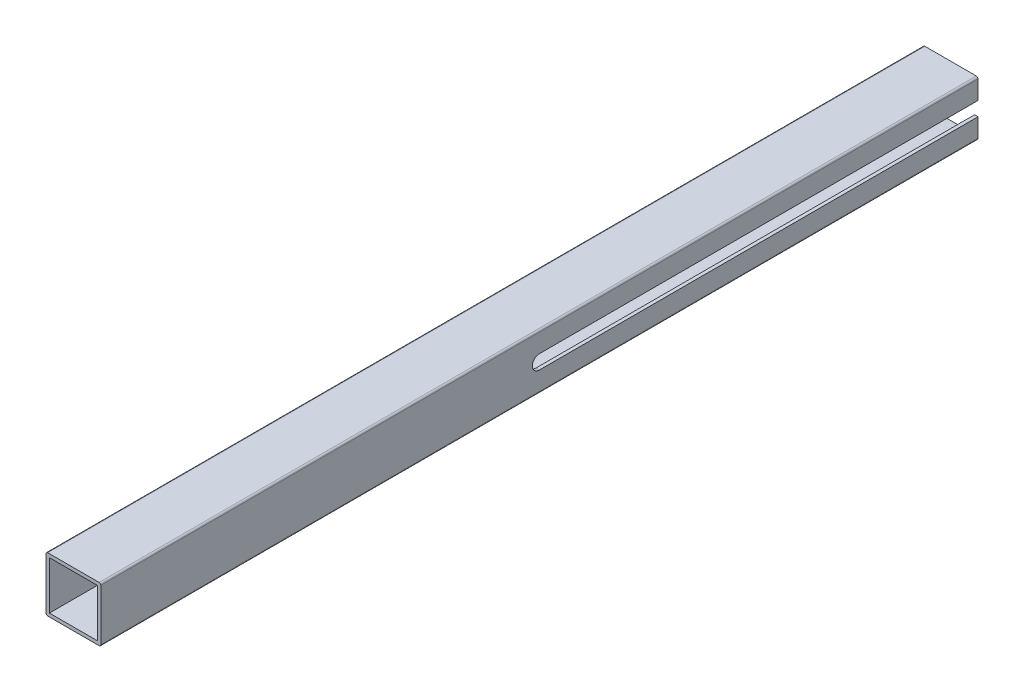
ISO-10303-21;
HEADER;
FILE_DESCRIPTION(('STEP AP214'),'2;1');
FILE_NAME('part.step','',(''),(''),'','','');
FILE_SCHEMA(('AUTOMOTIVE_DESIGN { 1 0 10303 214 1 1 1 1 }'));
ENDSEC;
DATA;
#1=APPLICATION_CONTEXT('core data for automotive mechanical design processes');
#2=APPLICATION_PROTOCOL_DEFINITION('international standard','automotive_design',2000,#1);
#3=PRODUCT_CONTEXT('',#1,'mechanical');
#4=PRODUCT('Part','Part','',(#3));
#5=PRODUCT_RELATED_PRODUCT_CATEGORY('part','',(#4));
#6=PRODUCT_DEFINITION_FORMATION('','',#4);
#7=PRODUCT_DEFINITION_CONTEXT('part definition',#1,'design');
#8=PRODUCT_DEFINITION('design','',#6,#7);
#9=PRODUCT_DEFINITION_SHAPE('','',#8);
#10=(LENGTH_UNIT() NAMED_UNIT(*) SI_UNIT(.MILLI.,.METRE.));
#11=(NAMED_UNIT(*) PLANE_ANGLE_UNIT() SI_UNIT($,.RADIAN.));
#12=(NAMED_UNIT(*) SI_UNIT($,.STERADIAN.) SOLID_ANGLE_UNIT());
#13=UNCERTAINTY_MEASURE_WITH_UNIT(LENGTH_MEASURE(1.E-05),#10,'distance_accuracy_value','');
#14=(GEOMETRIC_REPRESENTATION_CONTEXT(3) GLOBAL_UNCERTAINTY_ASSIGNED_CONTEXT((#13)) GLOBAL_UNIT_ASSIGNED_CONTEXT((#10,
#11,#12)) REPRESENTATION_CONTEXT('',''));
#15=CARTESIAN_POINT('',(0.,0.,0.));
#16=DIRECTION('',(0.,0.,1.));
#17=DIRECTION('',(1.,0.,0.));
#18=AXIS2_PLACEMENT_3D('',#15,#16,#17);
#19=CARTESIAN_POINT('',(0.,0.,-203.2));
#20=DIRECTION('',(0.,0.,-1.));
#21=DIRECTION('',(-1.,0.,0.));
#22=AXIS2_PLACEMENT_3D('',#19,#20,#21);
#23=PLANE('',#22);
#24=DIRECTION('',(1.,0.,0.));
#25=VECTOR('',#24,1.);
#26=CARTESIAN_POINT('',(-12.7,3.2639,-203.2));
#27=LINE('',#26,#25);
#28=CARTESIAN_POINT('',(-12.7,3.2639,-203.2));
#29=VERTEX_POINT('',#28);
#30=CARTESIAN_POINT('',(-11.1125,3.2639,-203.2));
#31=VERTEX_POINT('',#30);
#32=EDGE_CURVE('E202',#29,#31,#27,.T.);
#33=ORIENTED_EDGE('',*,*,#32,.F.);
#34=DIRECTION('',(0.,-1.,0.));
#35=VECTOR('',#34,1.);
#36=CARTESIAN_POINT('',(-12.7,-12.7,-203.2));
#37=LINE('',#36,#35);
#38=CARTESIAN_POINT('',(-12.7,11.90625,-203.2));
#39=VERTEX_POINT('',#38);
#40=EDGE_CURVE('E236',#39,#29,#37,.T.);
#41=ORIENTED_EDGE('',*,*,#40,.F.);
#42=CARTESIAN_POINT('',(-11.90625,11.90625,-203.2));
#43=DIRECTION('',(0.,0.,-1.));
#44=DIRECTION('',(-1.,0.,0.));
#45=AXIS2_PLACEMENT_3D('',#42,#43,#44);
#46=CIRCLE('',#45,0.79375);
#47=CARTESIAN_POINT('',(-11.90625,12.7,-203.2));
#48=VERTEX_POINT('',#47);
#49=EDGE_CURVE('E285',#39,#48,#46,.T.);
#50=ORIENTED_EDGE('',*,*,#49,.T.);
#51=DIRECTION('',(-1.,0.,0.));
#52=VECTOR('',#51,1.);
#53=CARTESIAN_POINT('',(-12.7,12.7,-203.2));
#54=LINE('',#53,#52);
#55=CARTESIAN_POINT('',(11.90625,12.7,-203.2));
#56=VERTEX_POINT('',#55);
#57=EDGE_CURVE('E232',#56,#48,#54,.T.);
#58=ORIENTED_EDGE('',*,*,#57,.F.);
#59=CARTESIAN_POINT('',(11.90625,11.90625,-203.2));
#60=DIRECTION('',(0.,0.,-1.));
#61=DIRECTION('',(-1.,0.,0.));
#62=AXIS2_PLACEMENT_3D('',#59,#60,#61);
#63=CIRCLE('',#62,0.79375);
#64=CARTESIAN_POINT('',(12.7,11.90625,-203.2));
#65=VERTEX_POINT('',#64);
#66=EDGE_CURVE('E277',#56,#65,#63,.T.);
#67=ORIENTED_EDGE('',*,*,#66,.T.);
#68=DIRECTION('',(0.,1.,0.));
#69=VECTOR('',#68,1.);
#70=CARTESIAN_POINT('',(12.7,-12.7,-203.2));
#71=LINE('',#70,#69);
#72=CARTESIAN_POINT('',(12.7,3.2639,-203.2));
#73=VERTEX_POINT('',#72);
#74=EDGE_CURVE('E228',#73,#65,#71,.T.);
#75=ORIENTED_EDGE('',*,*,#74,.F.);
#76=DIRECTION('',(1.,0.,0.));
#77=VECTOR('',#76,1.);
#78=CARTESIAN_POINT('',(-12.7,3.2639,-203.2));
#79=LINE('',#78,#77);
#80=CARTESIAN_POINT('',(11.1125,3.2639,-203.2));
#81=VERTEX_POINT('',#80);
#82=EDGE_CURVE('E41',#81,#73,#79,.T.);
#83=ORIENTED_EDGE('',*,*,#82,.F.);
#84=DIRECTION('',(0.,1.,0.));
#85=VECTOR('',#84,1.);
#86=CARTESIAN_POINT('',(11.1125,-11.1125,-203.2));
#87=LINE('',#86,#85);
#88=CARTESIAN_POINT('',(11.1125,11.1125,-203.2));
#89=VERTEX_POINT('',#88);
#90=EDGE_CURVE('E217',#81,#89,#87,.T.);
#91=ORIENTED_EDGE('',*,*,#90,.T.);
#92=DIRECTION('',(-1.,0.,0.));
#93=VECTOR('',#92,1.);
#94=CARTESIAN_POINT('',(-11.1125,11.1125,-203.2));
#95=LINE('',#94,#93);
#96=CARTESIAN_POINT('',(-11.1125,11.1125,-203.2));
#97=VERTEX_POINT('',#96);
#98=EDGE_CURVE('E221',#89,#97,#95,.T.);
#99=ORIENTED_EDGE('',*,*,#98,.T.);
#100=DIRECTION('',(0.,-1.,0.));
#101=VECTOR('',#100,1.);
#102=CARTESIAN_POINT('',(-11.1125,-11.1125,-203.2));
#103=LINE('',#102,#101);
#104=EDGE_CURVE('E225',#97,#31,#103,.T.);
#105=ORIENTED_EDGE('',*,*,#104,.T.);
#106=EDGE_LOOP('',(#33,#41,#50,#58,#67,#75,#83,#91,#99,#105));
#107=FACE_BOUND('',#106,.T.);
#108=ADVANCED_FACE('F33',(#107),#23,.T.);
#109=CARTESIAN_POINT('',(0.,0.,203.2));
#110=DIRECTION('',(0.,0.,-1.));
#111=DIRECTION('',(-1.,0.,0.));
#112=AXIS2_PLACEMENT_3D('',#109,#110,#111);
#113=PLANE('',#112);
#114=DIRECTION('',(-1.,0.,0.));
#115=VECTOR('',#114,1.);
#116=CARTESIAN_POINT('',(-12.7,12.7,203.2));
#117=LINE('',#116,#115);
#118=CARTESIAN_POINT('',(11.90625,12.7,203.2));
#119=VERTEX_POINT('',#118);
#120=CARTESIAN_POINT('',(-11.90625,12.7,203.2));
#121=VERTEX_POINT('',#120);
#122=EDGE_CURVE('E263',#119,#121,#117,.T.);
#123=ORIENTED_EDGE('',*,*,#122,.T.);
#124=CARTESIAN_POINT('',(-11.90625,11.90625,203.2));
#125=DIRECTION('',(0.,0.,-1.));
#126=DIRECTION('',(-1.,0.,0.));
#127=AXIS2_PLACEMENT_3D('',#124,#125,#126);
#128=CIRCLE('',#127,0.79375);
#129=CARTESIAN_POINT('',(-12.7,11.90625,203.2));
#130=VERTEX_POINT('',#129);
#131=EDGE_CURVE('E298',#121,#130,#128,.F.);
#132=ORIENTED_EDGE('',*,*,#131,.T.);
#133=DIRECTION('',(0.,-1.,0.));
#134=VECTOR('',#133,1.);
#135=CARTESIAN_POINT('',(-12.7,-12.7,203.2));
#136=LINE('',#135,#134);
#137=CARTESIAN_POINT('',(-12.7,-11.90625,203.2));
#138=VERTEX_POINT('',#137);
#139=EDGE_CURVE('E266',#130,#138,#136,.T.);
#140=ORIENTED_EDGE('',*,*,#139,.T.);
#141=CARTESIAN_POINT('',(-11.90625,-11.90625,203.2));
#142=DIRECTION('',(0.,0.,-1.));
#143=DIRECTION('',(-1.,0.,0.));
#144=AXIS2_PLACEMENT_3D('',#141,#142,#143);
#145=CIRCLE('',#144,0.79375);
#146=CARTESIAN_POINT('',(-11.90625,-12.7,203.2));
#147=VERTEX_POINT('',#146);
#148=EDGE_CURVE('E296',#138,#147,#145,.F.);
#149=ORIENTED_EDGE('',*,*,#148,.T.);
#150=DIRECTION('',(1.,0.,0.));
#151=VECTOR('',#150,1.);
#152=CARTESIAN_POINT('',(-12.7,-12.7,203.2));
#153=LINE('',#152,#151);
#154=CARTESIAN_POINT('',(11.90625,-12.7,203.2));
#155=VERTEX_POINT('',#154);
#156=EDGE_CURVE('E269',#147,#155,#153,.T.);
#157=ORIENTED_EDGE('',*,*,#156,.T.);
#158=CARTESIAN_POINT('',(11.90625,-11.90625,203.2));
#159=DIRECTION('',(0.,0.,-1.));
#160=DIRECTION('',(-1.,0.,0.));
#161=AXIS2_PLACEMENT_3D('',#158,#159,#160);
#162=CIRCLE('',#161,0.79375);
#163=CARTESIAN_POINT('',(12.7,-11.90625,203.2));
#164=VERTEX_POINT('',#163);
#165=EDGE_CURVE('E294',#155,#164,#162,.F.);
#166=ORIENTED_EDGE('',*,*,#165,.T.);
#167=DIRECTION('',(0.,1.,0.));
#168=VECTOR('',#167,1.);
#169=CARTESIAN_POINT('',(12.7,-12.7,203.2));
#170=LINE('',#169,#168);
#171=CARTESIAN_POINT('',(12.7,11.90625,203.2));
#172=VERTEX_POINT('',#171);
#173=EDGE_CURVE('E260',#164,#172,#170,.T.);
#174=ORIENTED_EDGE('',*,*,#173,.T.);
#175=CARTESIAN_POINT('',(11.90625,11.90625,203.2));
#176=DIRECTION('',(0.,0.,-1.));
#177=DIRECTION('',(-1.,0.,0.));
#178=AXIS2_PLACEMENT_3D('',#175,#176,#177);
#179=CIRCLE('',#178,0.79375);
#180=EDGE_CURVE('E292',#172,#119,#179,.F.);
#181=ORIENTED_EDGE('',*,*,#180,.T.);
#182=EDGE_LOOP('',(#123,#132,#140,#149,#157,#166,#174,#181));
#183=FACE_BOUND('',#182,.T.);
#184=DIRECTION('',(1.,0.,0.));
#185=VECTOR('',#184,1.);
#186=CARTESIAN_POINT('',(-11.1125,-11.1125,203.2));
#187=LINE('',#186,#185);
#188=CARTESIAN_POINT('',(-11.1125,-11.1125,203.2));
#189=VERTEX_POINT('',#188);
#190=CARTESIAN_POINT('',(11.1125,-11.1125,203.2));
#191=VERTEX_POINT('',#190);
#192=EDGE_CURVE('E241',#189,#191,#187,.T.);
#193=ORIENTED_EDGE('',*,*,#192,.F.);
#194=DIRECTION('',(0.,-1.,0.));
#195=VECTOR('',#194,1.);
#196=CARTESIAN_POINT('',(-11.1125,-11.1125,203.2));
#197=LINE('',#196,#195);
#198=CARTESIAN_POINT('',(-11.1125,11.1125,203.2));
#199=VERTEX_POINT('',#198);
#200=EDGE_CURVE('E248',#199,#189,#197,.T.);
#201=ORIENTED_EDGE('',*,*,#200,.F.);
#202=DIRECTION('',(-1.,0.,0.));
#203=VECTOR('',#202,1.);
#204=CARTESIAN_POINT('',(-11.1125,11.1125,203.2));
#205=LINE('',#204,#203);
#206=CARTESIAN_POINT('',(11.1125,11.1125,203.2));
#207=VERTEX_POINT('',#206);
#208=EDGE_CURVE('E245',#207,#199,#205,.T.);
#209=ORIENTED_EDGE('',*,*,#208,.F.);
#210=DIRECTION('',(0.,1.,0.));
#211=VECTOR('',#210,1.);
#212=CARTESIAN_POINT('',(11.1125,-11.1125,203.2));
#213=LINE('',#212,#211);
#214=EDGE_CURVE('E243',#191,#207,#213,.T.);
#215=ORIENTED_EDGE('',*,*,#214,.F.);
#216=EDGE_LOOP('',(#193,#201,#209,#215));
#217=FACE_BOUND('',#216,.T.);
#218=ADVANCED_FACE('F332',(#183,#217),#113,.F.);
#219=CARTESIAN_POINT('',(12.7,-12.7,203.2));
#220=DIRECTION('',(-1.,0.,0.));
#221=DIRECTION('',(0.,0.,1.));
#222=AXIS2_PLACEMENT_3D('',#219,#220,#221);
#223=PLANE('',#222);
#224=CARTESIAN_POINT('',(12.7,0.,0.));
#225=DIRECTION('',(1.,0.,0.));
#226=DIRECTION('',(0.,0.,-1.));
#227=AXIS2_PLACEMENT_3D('',#224,#225,#226);
#228=CIRCLE('',#227,3.2639);
#229=CARTESIAN_POINT('',(12.7,3.2639,0.));
#230=VERTEX_POINT('',#229);
#231=CARTESIAN_POINT('',(12.7,-3.2639,0.));
#232=VERTEX_POINT('',#231);
#233=EDGE_CURVE('E195',#230,#232,#228,.T.);
#234=ORIENTED_EDGE('',*,*,#233,.F.);
#235=DIRECTION('',(0.,0.,1.));
#236=VECTOR('',#235,1.);
#237=CARTESIAN_POINT('',(12.7,3.2639,0.));
#238=LINE('',#237,#236);
#239=EDGE_CURVE('E189',#73,#230,#238,.T.);
#240=ORIENTED_EDGE('',*,*,#239,.F.);
#241=ORIENTED_EDGE('',*,*,#74,.T.);
#242=DIRECTION('',(0.,0.,-1.));
#243=VECTOR('',#242,1.);
#244=CARTESIAN_POINT('',(12.7,11.90625,203.2));
#245=LINE('',#244,#243);
#246=EDGE_CURVE('E305',#65,#172,#245,.F.);
#247=ORIENTED_EDGE('',*,*,#246,.T.);
#248=ORIENTED_EDGE('',*,*,#173,.F.);
#249=DIRECTION('',(0.,0.,-1.));
#250=VECTOR('',#249,1.);
#251=CARTESIAN_POINT('',(12.7,-11.90625,203.2));
#252=LINE('',#251,#250);
#253=CARTESIAN_POINT('',(12.7,-11.90625,-203.2));
#254=VERTEX_POINT('',#253);
#255=EDGE_CURVE('E307',#164,#254,#252,.T.);
#256=ORIENTED_EDGE('',*,*,#255,.T.);
#257=CARTESIAN_POINT('',(12.7,-3.2639,-203.2));
#258=VERTEX_POINT('',#257);
#259=EDGE_CURVE('E229',#254,#258,#71,.T.);
#260=ORIENTED_EDGE('',*,*,#259,.T.);
#261=DIRECTION('',(0.,0.,-1.));
#262=VECTOR('',#261,1.);
#263=CARTESIAN_POINT('',(12.7,-3.2639,0.));
#264=LINE('',#263,#262);
#265=EDGE_CURVE('E48',#232,#258,#264,.T.);
#266=ORIENTED_EDGE('',*,*,#265,.F.);
#267=EDGE_LOOP('',(#234,#240,#241,#247,#248,#256,#260,#266));
#268=FACE_BOUND('',#267,.T.);
#269=ADVANCED_FACE('F322',(#268),#223,.F.);
#270=CARTESIAN_POINT('',(-12.7,12.7,203.2));
#271=DIRECTION('',(0.,-1.,0.));
#272=DIRECTION('',(0.,0.,-1.));
#273=AXIS2_PLACEMENT_3D('',#270,#271,#272);
#274=PLANE('',#273);
#275=ORIENTED_EDGE('',*,*,#57,.T.);
#276=DIRECTION('',(0.,0.,-1.));
#277=VECTOR('',#276,1.);
#278=CARTESIAN_POINT('',(-11.90625,12.7,203.2));
#279=LINE('',#278,#277);
#280=EDGE_CURVE('E290',#48,#121,#279,.F.);
#281=ORIENTED_EDGE('',*,*,#280,.T.);
#282=ORIENTED_EDGE('',*,*,#122,.F.);
#283=DIRECTION('',(0.,0.,-1.));
#284=VECTOR('',#283,1.);
#285=CARTESIAN_POINT('',(11.90625,12.7,203.2));
#286=LINE('',#285,#284);
#287=EDGE_CURVE('E287',#119,#56,#286,.T.);
#288=ORIENTED_EDGE('',*,*,#287,.T.);
#289=EDGE_LOOP('',(#275,#281,#282,#288));
#290=FACE_BOUND('',#289,.T.);
#291=ADVANCED_FACE('F401',(#290),#274,.F.);
#292=CARTESIAN_POINT('',(-12.7,-12.7,203.2));
#293=DIRECTION('',(1.,0.,0.));
#294=DIRECTION('',(0.,0.,-1.));
#295=AXIS2_PLACEMENT_3D('',#292,#293,#294);
#296=PLANE('',#295);
#297=ORIENTED_EDGE('',*,*,#40,.T.);
#298=DIRECTION('',(0.,0.,1.));
#299=VECTOR('',#298,1.);
#300=CARTESIAN_POINT('',(-12.7,3.2639,0.));
#301=LINE('',#300,#299);
#302=CARTESIAN_POINT('',(-12.7,3.2639,0.));
#303=VERTEX_POINT('',#302);
#304=EDGE_CURVE('E185',#29,#303,#301,.T.);
#305=ORIENTED_EDGE('',*,*,#304,.T.);
#306=CARTESIAN_POINT('',(-12.7,0.,0.));
#307=DIRECTION('',(1.,0.,0.));
#308=DIRECTION('',(0.,0.,-1.));
#309=AXIS2_PLACEMENT_3D('',#306,#307,#308);
#310=CIRCLE('',#309,3.2639);
#311=CARTESIAN_POINT('',(-12.7,-3.2639,0.));
#312=VERTEX_POINT('',#311);
#313=EDGE_CURVE('E174',#303,#312,#310,.T.);
#314=ORIENTED_EDGE('',*,*,#313,.T.);
#315=DIRECTION('',(0.,0.,-1.));
#316=VECTOR('',#315,1.);
#317=CARTESIAN_POINT('',(-12.7,-3.2639,0.));
#318=LINE('',#317,#316);
#319=CARTESIAN_POINT('',(-12.7,-3.2639,-203.2));
#320=VERTEX_POINT('',#319);
#321=EDGE_CURVE('E181',#312,#320,#318,.T.);
#322=ORIENTED_EDGE('',*,*,#321,.T.);
#323=CARTESIAN_POINT('',(-12.7,-11.90625,-203.2));
#324=VERTEX_POINT('',#323);
#325=EDGE_CURVE('E235',#320,#324,#37,.T.);
#326=ORIENTED_EDGE('',*,*,#325,.T.);
#327=DIRECTION('',(0.,0.,-1.));
#328=VECTOR('',#327,1.);
#329=CARTESIAN_POINT('',(-12.7,-11.90625,203.2));
#330=LINE('',#329,#328);
#331=EDGE_CURVE('E272',#324,#138,#330,.F.);
#332=ORIENTED_EDGE('',*,*,#331,.T.);
#333=ORIENTED_EDGE('',*,*,#139,.F.);
#334=DIRECTION('',(0.,0.,-1.));
#335=VECTOR('',#334,1.);
#336=CARTESIAN_POINT('',(-12.7,11.90625,203.2));
#337=LINE('',#336,#335);
#338=EDGE_CURVE('E274',#130,#39,#337,.T.);
#339=ORIENTED_EDGE('',*,*,#338,.T.);
#340=EDGE_LOOP('',(#297,#305,#314,#322,#326,#332,#333,#339));
#341=FACE_BOUND('',#340,.T.);
#342=ADVANCED_FACE('F188',(#341),#296,.F.);
#343=CARTESIAN_POINT('',(-12.7,-12.7,203.2));
#344=DIRECTION('',(0.,1.,0.));
#345=DIRECTION('',(0.,0.,1.));
#346=AXIS2_PLACEMENT_3D('',#343,#344,#345);
#347=PLANE('',#346);
#348=ORIENTED_EDGE('',*,*,#156,.F.);
#349=DIRECTION('',(0.,0.,-1.));
#350=VECTOR('',#349,1.);
#351=CARTESIAN_POINT('',(-11.90625,-12.7,203.2));
#352=LINE('',#351,#350);
#353=CARTESIAN_POINT('',(-11.90625,-12.7,-203.2));
#354=VERTEX_POINT('',#353);
#355=EDGE_CURVE('E302',#147,#354,#352,.T.);
#356=ORIENTED_EDGE('',*,*,#355,.T.);
#357=DIRECTION('',(1.,0.,0.));
#358=VECTOR('',#357,1.);
#359=CARTESIAN_POINT('',(-12.7,-12.7,-203.2));
#360=LINE('',#359,#358);
#361=CARTESIAN_POINT('',(11.90625,-12.7,-203.2));
#362=VERTEX_POINT('',#361);
#363=EDGE_CURVE('E238',#354,#362,#360,.T.);
#364=ORIENTED_EDGE('',*,*,#363,.T.);
#365=DIRECTION('',(0.,0.,-1.));
#366=VECTOR('',#365,1.);
#367=CARTESIAN_POINT('',(11.90625,-12.7,203.2));
#368=LINE('',#367,#366);
#369=EDGE_CURVE('E300',#362,#155,#368,.F.);
#370=ORIENTED_EDGE('',*,*,#369,.T.);
#371=EDGE_LOOP('',(#348,#356,#364,#370));
#372=FACE_BOUND('',#371,.T.);
#373=ADVANCED_FACE('F393',(#372),#347,.F.);
#374=CARTESIAN_POINT('',(-11.1125,-11.1125,203.2));
#375=DIRECTION('',(0.,1.,0.));
#376=DIRECTION('',(0.,0.,1.));
#377=AXIS2_PLACEMENT_3D('',#374,#375,#376);
#378=PLANE('',#377);
#379=DIRECTION('',(0.,0.,-1.));
#380=VECTOR('',#379,1.);
#381=CARTESIAN_POINT('',(11.1125,-11.1125,203.2));
#382=LINE('',#381,#380);
#383=CARTESIAN_POINT('',(11.1125,-11.1125,-203.2));
#384=VERTEX_POINT('',#383);
#385=EDGE_CURVE('E258',#191,#384,#382,.T.);
#386=ORIENTED_EDGE('',*,*,#385,.T.);
#387=DIRECTION('',(1.,0.,0.));
#388=VECTOR('',#387,1.);
#389=CARTESIAN_POINT('',(-11.1125,-11.1125,-203.2));
#390=LINE('',#389,#388);
#391=CARTESIAN_POINT('',(-11.1125,-11.1125,-203.2));
#392=VERTEX_POINT('',#391);
#393=EDGE_CURVE('E214',#392,#384,#390,.T.);
#394=ORIENTED_EDGE('',*,*,#393,.F.);
#395=DIRECTION('',(0.,0.,-1.));
#396=VECTOR('',#395,1.);
#397=CARTESIAN_POINT('',(-11.1125,-11.1125,203.2));
#398=LINE('',#397,#396);
#399=EDGE_CURVE('E250',#189,#392,#398,.T.);
#400=ORIENTED_EDGE('',*,*,#399,.F.);
#401=ORIENTED_EDGE('',*,*,#192,.T.);
#402=EDGE_LOOP('',(#386,#394,#400,#401));
#403=FACE_BOUND('',#402,.T.);
#404=ADVANCED_FACE('F391',(#403),#378,.T.);
#405=CARTESIAN_POINT('',(11.1125,-11.1125,203.2));
#406=DIRECTION('',(-1.,0.,0.));
#407=DIRECTION('',(0.,-1.,0.));
#408=AXIS2_PLACEMENT_3D('',#405,#406,#407);
#409=PLANE('',#408);
#410=DIRECTION('',(0.,0.,-1.));
#411=VECTOR('',#410,1.);
#412=CARTESIAN_POINT('',(11.1125,3.2639,203.2));
#413=LINE('',#412,#411);
#414=CARTESIAN_POINT('',(11.1125,3.2639,0.));
#415=VERTEX_POINT('',#414);
#416=EDGE_CURVE('E210',#415,#81,#413,.T.);
#417=ORIENTED_EDGE('',*,*,#416,.F.);
#418=CARTESIAN_POINT('',(11.1125,0.,0.));
#419=DIRECTION('',(-1.,0.,0.));
#420=DIRECTION('',(0.,-1.,0.));
#421=AXIS2_PLACEMENT_3D('',#418,#419,#420);
#422=CIRCLE('',#421,3.2639);
#423=CARTESIAN_POINT('',(11.1125,-3.2639,0.));
#424=VERTEX_POINT('',#423);
#425=EDGE_CURVE('E212',#424,#415,#422,.T.);
#426=ORIENTED_EDGE('',*,*,#425,.F.);
#427=DIRECTION('',(0.,0.,1.));
#428=VECTOR('',#427,1.);
#429=CARTESIAN_POINT('',(11.1125,-3.2639,203.2));
#430=LINE('',#429,#428);
#431=CARTESIAN_POINT('',(11.1125,-3.2639,-203.2));
#432=VERTEX_POINT('',#431);
#433=EDGE_CURVE('E206',#432,#424,#430,.T.);
#434=ORIENTED_EDGE('',*,*,#433,.F.);
#435=EDGE_CURVE('E218',#384,#432,#87,.T.);
#436=ORIENTED_EDGE('',*,*,#435,.F.);
#437=ORIENTED_EDGE('',*,*,#385,.F.);
#438=ORIENTED_EDGE('',*,*,#214,.T.);
#439=DIRECTION('',(0.,0.,-1.));
#440=VECTOR('',#439,1.);
#441=CARTESIAN_POINT('',(11.1125,11.1125,203.2));
#442=LINE('',#441,#440);
#443=EDGE_CURVE('E255',#207,#89,#442,.T.);
#444=ORIENTED_EDGE('',*,*,#443,.T.);
#445=ORIENTED_EDGE('',*,*,#90,.F.);
#446=EDGE_LOOP('',(#417,#426,#434,#436,#437,#438,#444,#445));
#447=FACE_BOUND('',#446,.T.);
#448=ADVANCED_FACE('F350',(#447),#409,.T.);
#449=CARTESIAN_POINT('',(-11.1125,11.1125,203.2));
#450=DIRECTION('',(0.,-1.,0.));
#451=DIRECTION('',(1.,0.,0.));
#452=AXIS2_PLACEMENT_3D('',#449,#450,#451);
#453=PLANE('',#452);
#454=DIRECTION('',(0.,0.,-1.));
#455=VECTOR('',#454,1.);
#456=CARTESIAN_POINT('',(-11.1125,11.1125,203.2));
#457=LINE('',#456,#455);
#458=EDGE_CURVE('E253',#199,#97,#457,.T.);
#459=ORIENTED_EDGE('',*,*,#458,.T.);
#460=ORIENTED_EDGE('',*,*,#98,.F.);
#461=ORIENTED_EDGE('',*,*,#443,.F.);
#462=ORIENTED_EDGE('',*,*,#208,.T.);
#463=EDGE_LOOP('',(#459,#460,#461,#462));
#464=FACE_BOUND('',#463,.T.);
#465=ADVANCED_FACE('F380',(#464),#453,.T.);
#466=CARTESIAN_POINT('',(-11.1125,-11.1125,203.2));
#467=DIRECTION('',(1.,0.,0.));
#468=DIRECTION('',(0.,0.,-1.));
#469=AXIS2_PLACEMENT_3D('',#466,#467,#468);
#470=PLANE('',#469);
#471=DIRECTION('',(0.,0.,1.));
#472=VECTOR('',#471,1.);
#473=CARTESIAN_POINT('',(-11.1125,3.2639,203.2));
#474=LINE('',#473,#472);
#475=CARTESIAN_POINT('',(-11.1125,3.2639,0.));
#476=VERTEX_POINT('',#475);
#477=EDGE_CURVE('E208',#31,#476,#474,.T.);
#478=ORIENTED_EDGE('',*,*,#477,.F.);
#479=ORIENTED_EDGE('',*,*,#104,.F.);
#480=ORIENTED_EDGE('',*,*,#458,.F.);
#481=ORIENTED_EDGE('',*,*,#200,.T.);
#482=ORIENTED_EDGE('',*,*,#399,.T.);
#483=CARTESIAN_POINT('',(-11.1125,-3.2639,-203.2));
#484=VERTEX_POINT('',#483);
#485=EDGE_CURVE('E224',#484,#392,#103,.T.);
#486=ORIENTED_EDGE('',*,*,#485,.F.);
#487=DIRECTION('',(0.,0.,-1.));
#488=VECTOR('',#487,1.);
#489=CARTESIAN_POINT('',(-11.1125,-3.2639,203.2));
#490=LINE('',#489,#488);
#491=CARTESIAN_POINT('',(-11.1125,-3.2639,0.));
#492=VERTEX_POINT('',#491);
#493=EDGE_CURVE('E56',#492,#484,#490,.T.);
#494=ORIENTED_EDGE('',*,*,#493,.F.);
#495=CARTESIAN_POINT('',(-11.1125,0.,0.));
#496=DIRECTION('',(1.,0.,0.));
#497=DIRECTION('',(0.,0.,-1.));
#498=AXIS2_PLACEMENT_3D('',#495,#496,#497);
#499=CIRCLE('',#498,3.2639);
#500=EDGE_CURVE('E11',#476,#492,#499,.T.);
#501=ORIENTED_EDGE('',*,*,#500,.F.);
#502=EDGE_LOOP('',(#478,#479,#480,#481,#482,#486,#494,#501));
#503=FACE_BOUND('',#502,.T.);
#504=ADVANCED_FACE('F372',(#503),#470,.T.);
#505=DIRECTION('',(-1.,0.,0.));
#506=VECTOR('',#505,1.);
#507=CARTESIAN_POINT('',(0.,-3.2639,-203.2));
#508=LINE('',#507,#506);
#509=EDGE_CURVE('E310',#258,#432,#508,.T.);
#510=ORIENTED_EDGE('',*,*,#509,.F.);
#511=ORIENTED_EDGE('',*,*,#259,.F.);
#512=CARTESIAN_POINT('',(11.90625,-11.90625,-203.2));
#513=DIRECTION('',(0.,0.,-1.));
#514=DIRECTION('',(-1.,0.,0.));
#515=AXIS2_PLACEMENT_3D('',#512,#513,#514);
#516=CIRCLE('',#515,0.79375);
#517=EDGE_CURVE('E280',#254,#362,#516,.T.);
#518=ORIENTED_EDGE('',*,*,#517,.T.);
#519=ORIENTED_EDGE('',*,*,#363,.F.);
#520=CARTESIAN_POINT('',(-11.90625,-11.90625,-203.2));
#521=DIRECTION('',(0.,0.,-1.));
#522=DIRECTION('',(-1.,0.,0.));
#523=AXIS2_PLACEMENT_3D('',#520,#521,#522);
#524=CIRCLE('',#523,0.79375);
#525=EDGE_CURVE('E282',#354,#324,#524,.T.);
#526=ORIENTED_EDGE('',*,*,#525,.T.);
#527=ORIENTED_EDGE('',*,*,#325,.F.);
#528=DIRECTION('',(1.,0.,0.));
#529=VECTOR('',#528,1.);
#530=CARTESIAN_POINT('',(-12.7,-3.2639,-203.2));
#531=LINE('',#530,#529);
#532=EDGE_CURVE('E177',#320,#484,#531,.T.);
#533=ORIENTED_EDGE('',*,*,#532,.T.);
#534=ORIENTED_EDGE('',*,*,#485,.T.);
#535=ORIENTED_EDGE('',*,*,#393,.T.);
#536=ORIENTED_EDGE('',*,*,#435,.T.);
#537=EDGE_LOOP('',(#510,#511,#518,#519,#526,#527,#533,#534,#535,#536));
#538=FACE_BOUND('',#537,.T.);
#539=ADVANCED_FACE('F342',(#538),#23,.T.);
#540=CARTESIAN_POINT('',(-11.90625,11.90625,203.2));
#541=DIRECTION('',(0.,0.,-1.));
#542=DIRECTION('',(-1.,0.,0.));
#543=AXIS2_PLACEMENT_3D('',#540,#541,#542);
#544=CYLINDRICAL_SURFACE('',#543,0.79375);
#545=ORIENTED_EDGE('',*,*,#131,.F.);
#546=ORIENTED_EDGE('',*,*,#280,.F.);
#547=ORIENTED_EDGE('',*,*,#49,.F.);
#548=ORIENTED_EDGE('',*,*,#338,.F.);
#549=EDGE_LOOP('',(#545,#546,#547,#548));
#550=FACE_BOUND('',#549,.T.);
#551=ADVANCED_FACE('F371',(#550),#544,.T.);
#552=CARTESIAN_POINT('',(-11.90625,-11.90625,203.2));
#553=DIRECTION('',(0.,0.,-1.));
#554=DIRECTION('',(-1.,0.,0.));
#555=AXIS2_PLACEMENT_3D('',#552,#553,#554);
#556=CYLINDRICAL_SURFACE('',#555,0.79375);
#557=ORIENTED_EDGE('',*,*,#148,.F.);
#558=ORIENTED_EDGE('',*,*,#331,.F.);
#559=ORIENTED_EDGE('',*,*,#525,.F.);
#560=ORIENTED_EDGE('',*,*,#355,.F.);
#561=EDGE_LOOP('',(#557,#558,#559,#560));
#562=FACE_BOUND('',#561,.T.);
#563=ADVANCED_FACE('F377',(#562),#556,.T.);
#564=CARTESIAN_POINT('',(11.90625,-11.90625,203.2));
#565=DIRECTION('',(0.,0.,-1.));
#566=DIRECTION('',(-1.,0.,0.));
#567=AXIS2_PLACEMENT_3D('',#564,#565,#566);
#568=CYLINDRICAL_SURFACE('',#567,0.79375);
#569=ORIENTED_EDGE('',*,*,#165,.F.);
#570=ORIENTED_EDGE('',*,*,#369,.F.);
#571=ORIENTED_EDGE('',*,*,#517,.F.);
#572=ORIENTED_EDGE('',*,*,#255,.F.);
#573=EDGE_LOOP('',(#569,#570,#571,#572));
#574=FACE_BOUND('',#573,.T.);
#575=ADVANCED_FACE('F339',(#574),#568,.T.);
#576=CARTESIAN_POINT('',(11.90625,11.90625,203.2));
#577=DIRECTION('',(0.,0.,-1.));
#578=DIRECTION('',(-1.,0.,0.));
#579=AXIS2_PLACEMENT_3D('',#576,#577,#578);
#580=CYLINDRICAL_SURFACE('',#579,0.79375);
#581=ORIENTED_EDGE('',*,*,#180,.F.);
#582=ORIENTED_EDGE('',*,*,#246,.F.);
#583=ORIENTED_EDGE('',*,*,#66,.F.);
#584=ORIENTED_EDGE('',*,*,#287,.F.);
#585=EDGE_LOOP('',(#581,#582,#583,#584));
#586=FACE_BOUND('',#585,.T.);
#587=ADVANCED_FACE('F35',(#586),#580,.T.);
#588=CARTESIAN_POINT('',(-12.7,-3.2639,0.));
#589=DIRECTION('',(0.,-1.,0.));
#590=DIRECTION('',(0.,0.,-1.));
#591=AXIS2_PLACEMENT_3D('',#588,#589,#590);
#592=PLANE('',#591);
#593=ORIENTED_EDGE('',*,*,#493,.T.);
#594=ORIENTED_EDGE('',*,*,#532,.F.);
#595=ORIENTED_EDGE('',*,*,#321,.F.);
#596=DIRECTION('',(1.,0.,0.));
#597=VECTOR('',#596,1.);
#598=CARTESIAN_POINT('',(-12.7,-3.2639,0.));
#599=LINE('',#598,#597);
#600=EDGE_CURVE('E169',#312,#492,#599,.T.);
#601=ORIENTED_EDGE('',*,*,#600,.T.);
#602=EDGE_LOOP('',(#593,#594,#595,#601));
#603=FACE_BOUND('',#602,.T.);
#604=ADVANCED_FACE('F182',(#603),#592,.F.);
#605=CARTESIAN_POINT('',(-12.7,3.2639,0.));
#606=DIRECTION('',(0.,1.,0.));
#607=DIRECTION('',(0.,0.,1.));
#608=AXIS2_PLACEMENT_3D('',#605,#606,#607);
#609=PLANE('',#608);
#610=ORIENTED_EDGE('',*,*,#477,.T.);
#611=DIRECTION('',(1.,0.,0.));
#612=VECTOR('',#611,1.);
#613=CARTESIAN_POINT('',(-12.7,3.2639,0.));
#614=LINE('',#613,#612);
#615=EDGE_CURVE('E199',#303,#476,#614,.T.);
#616=ORIENTED_EDGE('',*,*,#615,.F.);
#617=ORIENTED_EDGE('',*,*,#304,.F.);
#618=ORIENTED_EDGE('',*,*,#32,.T.);
#619=EDGE_LOOP('',(#610,#616,#617,#618));
#620=FACE_BOUND('',#619,.T.);
#621=ADVANCED_FACE('F361',(#620),#609,.F.);
#622=CARTESIAN_POINT('',(-12.7,0.,0.));
#623=DIRECTION('',(1.,0.,0.));
#624=DIRECTION('',(0.,0.,-1.));
#625=AXIS2_PLACEMENT_3D('',#622,#623,#624);
#626=CYLINDRICAL_SURFACE('',#625,3.2639);
#627=ORIENTED_EDGE('',*,*,#500,.T.);
#628=ORIENTED_EDGE('',*,*,#600,.F.);
#629=ORIENTED_EDGE('',*,*,#313,.F.);
#630=ORIENTED_EDGE('',*,*,#615,.T.);
#631=EDGE_LOOP('',(#627,#628,#629,#630));
#632=FACE_BOUND('',#631,.T.);
#633=ADVANCED_FACE('F171',(#632),#626,.F.);
#634=ORIENTED_EDGE('',*,*,#425,.T.);
#635=EDGE_CURVE('E201',#415,#230,#614,.T.);
#636=ORIENTED_EDGE('',*,*,#635,.T.);
#637=ORIENTED_EDGE('',*,*,#233,.T.);
#638=EDGE_CURVE('E178',#424,#232,#599,.T.);
#639=ORIENTED_EDGE('',*,*,#638,.F.);
#640=EDGE_LOOP('',(#634,#636,#637,#639));
#641=FACE_BOUND('',#640,.T.);
#642=ADVANCED_FACE('F353',(#641),#626,.F.);
#643=ORIENTED_EDGE('',*,*,#416,.T.);
#644=ORIENTED_EDGE('',*,*,#82,.T.);
#645=ORIENTED_EDGE('',*,*,#239,.T.);
#646=ORIENTED_EDGE('',*,*,#635,.F.);
#647=EDGE_LOOP('',(#643,#644,#645,#646));
#648=FACE_BOUND('',#647,.T.);
#649=ADVANCED_FACE('F314',(#648),#609,.F.);
#650=ORIENTED_EDGE('',*,*,#433,.T.);
#651=ORIENTED_EDGE('',*,*,#638,.T.);
#652=ORIENTED_EDGE('',*,*,#265,.T.);
#653=ORIENTED_EDGE('',*,*,#509,.T.);
#654=EDGE_LOOP('',(#650,#651,#652,#653));
#655=FACE_BOUND('',#654,.T.);
#656=ADVANCED_FACE('F346',(#655),#592,.F.);
#657=CLOSED_SHELL('',(#108,#218,#269,#291,#342,#373,#404,#448,#465,#504,#539,#551,#563,#575,
#587,#604,#621,#633,#642,#649,#656));
#658=MANIFOLD_SOLID_BREP('B2',#657);
#659=ADVANCED_BREP_SHAPE_REPRESENTATION('',(#18,#658),#14);
#660=SHAPE_DEFINITION_REPRESENTATION(#9,#659);
ENDSEC;
END-ISO-10303-21;
